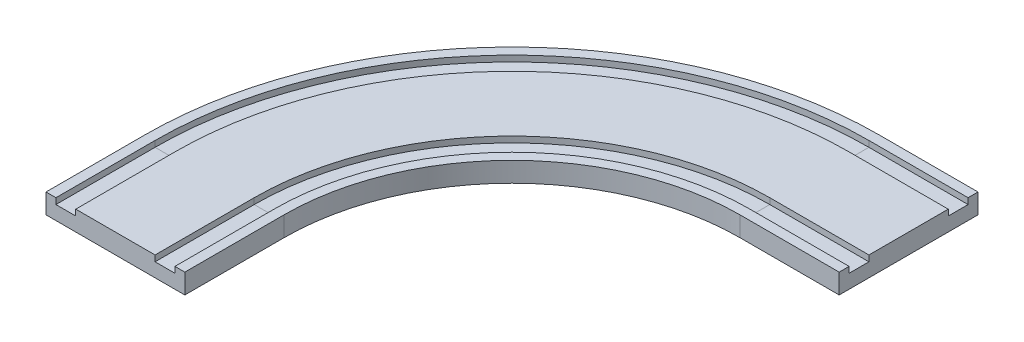
ISO-10303-21;
HEADER;
FILE_DESCRIPTION(('STEP AP214'),'2;1');
FILE_NAME('part.step','',(''),(''),'','','');
FILE_SCHEMA(('AUTOMOTIVE_DESIGN { 1 0 10303 214 1 1 1 1 }'));
ENDSEC;
DATA;
#1=APPLICATION_CONTEXT('core data for automotive mechanical design processes');
#2=APPLICATION_PROTOCOL_DEFINITION('international standard','automotive_design',2000,#1);
#3=PRODUCT_CONTEXT('',#1,'mechanical');
#4=PRODUCT('Part','Part','',(#3));
#5=PRODUCT_RELATED_PRODUCT_CATEGORY('part','',(#4));
#6=PRODUCT_DEFINITION_FORMATION('','',#4);
#7=PRODUCT_DEFINITION_CONTEXT('part definition',#1,'design');
#8=PRODUCT_DEFINITION('design','',#6,#7);
#9=PRODUCT_DEFINITION_SHAPE('','',#8);
#10=(LENGTH_UNIT() NAMED_UNIT(*) SI_UNIT(.MILLI.,.METRE.));
#11=(NAMED_UNIT(*) PLANE_ANGLE_UNIT() SI_UNIT($,.RADIAN.));
#12=(NAMED_UNIT(*) SI_UNIT($,.STERADIAN.) SOLID_ANGLE_UNIT());
#13=UNCERTAINTY_MEASURE_WITH_UNIT(LENGTH_MEASURE(1.E-05),#10,'distance_accuracy_value','');
#14=(GEOMETRIC_REPRESENTATION_CONTEXT(3) GLOBAL_UNCERTAINTY_ASSIGNED_CONTEXT((#13)) GLOBAL_UNIT_ASSIGNED_CONTEXT((#10,
#11,#12)) REPRESENTATION_CONTEXT('',''));
#15=CARTESIAN_POINT('',(0.,0.,0.));
#16=DIRECTION('',(0.,0.,1.));
#17=DIRECTION('',(1.,0.,0.));
#18=AXIS2_PLACEMENT_3D('',#15,#16,#17);
#19=CARTESIAN_POINT('',(200.,10.,-164.999999999996));
#20=DIRECTION('',(-1.,0.,0.));
#21=DIRECTION('',(0.,0.,1.));
#22=AXIS2_PLACEMENT_3D('',#19,#20,#21);
#23=PLANE('',#22);
#24=DIRECTION('',(0.,-1.,0.));
#25=VECTOR('',#24,1.);
#26=CARTESIAN_POINT('',(200.000000000001,10.,-179.999999999997));
#27=LINE('',#26,#25);
#28=CARTESIAN_POINT('',(200.000000000001,10.,-179.999999999997));
#29=VERTEX_POINT('',#28);
#30=CARTESIAN_POINT('',(200.000000000001,7.,-179.999999999998));
#31=VERTEX_POINT('',#30);
#32=EDGE_CURVE('E279',#29,#31,#27,.T.);
#33=ORIENTED_EDGE('',*,*,#32,.T.);
#34=DIRECTION('',(0.,0.,1.));
#35=VECTOR('',#34,1.);
#36=CARTESIAN_POINT('',(200.000000000001,7.,-169.999999999997));
#37=LINE('',#36,#35);
#38=CARTESIAN_POINT('',(200.000000000001,7.,-169.999999999997));
#39=VERTEX_POINT('',#38);
#40=EDGE_CURVE('E312',#31,#39,#37,.T.);
#41=ORIENTED_EDGE('',*,*,#40,.T.);
#42=DIRECTION('',(0.,1.,0.));
#43=VECTOR('',#42,1.);
#44=CARTESIAN_POINT('',(200.000000000001,10.,-169.999999999997));
#45=LINE('',#44,#43);
#46=CARTESIAN_POINT('',(200.000000000001,10.,-169.999999999997));
#47=VERTEX_POINT('',#46);
#48=EDGE_CURVE('E276',#39,#47,#45,.T.);
#49=ORIENTED_EDGE('',*,*,#48,.T.);
#50=DIRECTION('',(0.,0.,-1.));
#51=VECTOR('',#50,1.);
#52=CARTESIAN_POINT('',(200.,10.,-164.999999999996));
#53=LINE('',#52,#51);
#54=CARTESIAN_POINT('',(200.,10.,-164.999999999996));
#55=VERTEX_POINT('',#54);
#56=EDGE_CURVE('E357',#55,#47,#53,.T.);
#57=ORIENTED_EDGE('',*,*,#56,.F.);
#58=DIRECTION('',(0.,-1.,0.));
#59=VECTOR('',#58,1.);
#60=CARTESIAN_POINT('',(200.,10.,-164.999999999996));
#61=LINE('',#60,#59);
#62=CARTESIAN_POINT('',(200.,0.,-164.999999999996));
#63=VERTEX_POINT('',#62);
#64=EDGE_CURVE('E401',#55,#63,#61,.T.);
#65=ORIENTED_EDGE('',*,*,#64,.T.);
#66=DIRECTION('',(0.,0.,-1.));
#67=VECTOR('',#66,1.);
#68=CARTESIAN_POINT('',(200.,0.,-164.999999999996));
#69=LINE('',#68,#67);
#70=CARTESIAN_POINT('',(200.000000000001,0.,-234.999999999997));
#71=VERTEX_POINT('',#70);
#72=EDGE_CURVE('E378',#63,#71,#69,.T.);
#73=ORIENTED_EDGE('',*,*,#72,.T.);
#74=DIRECTION('',(0.,-1.,0.));
#75=VECTOR('',#74,1.);
#76=CARTESIAN_POINT('',(200.000000000001,10.,-234.999999999997));
#77=LINE('',#76,#75);
#78=CARTESIAN_POINT('',(200.000000000001,10.,-234.999999999997));
#79=VERTEX_POINT('',#78);
#80=EDGE_CURVE('E398',#79,#71,#77,.T.);
#81=ORIENTED_EDGE('',*,*,#80,.F.);
#82=CARTESIAN_POINT('',(200.000000000001,10.,-229.999999999997));
#83=VERTEX_POINT('',#82);
#84=EDGE_CURVE('E356',#83,#79,#53,.T.);
#85=ORIENTED_EDGE('',*,*,#84,.F.);
#86=DIRECTION('',(0.,-1.,0.));
#87=VECTOR('',#86,1.);
#88=CARTESIAN_POINT('',(200.000000000001,10.,-229.999999999997));
#89=LINE('',#88,#87);
#90=CARTESIAN_POINT('',(200.000000000001,7.,-229.999999999998));
#91=VERTEX_POINT('',#90);
#92=EDGE_CURVE('E288',#83,#91,#89,.T.);
#93=ORIENTED_EDGE('',*,*,#92,.T.);
#94=DIRECTION('',(0.,0.,1.));
#95=VECTOR('',#94,1.);
#96=CARTESIAN_POINT('',(200.000000000001,7.,-229.999999999997));
#97=LINE('',#96,#95);
#98=CARTESIAN_POINT('',(200.000000000001,7.,-219.999999999997));
#99=VERTEX_POINT('',#98);
#100=EDGE_CURVE('E285',#91,#99,#97,.T.);
#101=ORIENTED_EDGE('',*,*,#100,.T.);
#102=DIRECTION('',(0.,1.,0.));
#103=VECTOR('',#102,1.);
#104=CARTESIAN_POINT('',(200.000000000001,10.,-219.999999999997));
#105=LINE('',#104,#103);
#106=CARTESIAN_POINT('',(200.000000000001,10.,-219.999999999997));
#107=VERTEX_POINT('',#106);
#108=EDGE_CURVE('E281',#99,#107,#105,.T.);
#109=ORIENTED_EDGE('',*,*,#108,.T.);
#110=EDGE_CURVE('E360',#29,#107,#53,.T.);
#111=ORIENTED_EDGE('',*,*,#110,.F.);
#112=EDGE_LOOP('',(#33,#41,#49,#57,#65,#73,#81,#85,#93,#101,#109,#111));
#113=FACE_BOUND('',#112,.T.);
#114=ADVANCED_FACE('F54',(#113),#23,.F.);
#115=CARTESIAN_POINT('',(-35.,10.,0.));
#116=DIRECTION('',(0.,0.,-1.));
#117=DIRECTION('',(-1.,0.,0.));
#118=AXIS2_PLACEMENT_3D('',#115,#116,#117);
#119=PLANE('',#118);
#120=DIRECTION('',(0.,1.,0.));
#121=VECTOR('',#120,1.);
#122=CARTESIAN_POINT('',(20.,10.,0.));
#123=LINE('',#122,#121);
#124=CARTESIAN_POINT('',(20.,7.,0.));
#125=VERTEX_POINT('',#124);
#126=CARTESIAN_POINT('',(20.,10.,0.));
#127=VERTEX_POINT('',#126);
#128=EDGE_CURVE('E280',#125,#127,#123,.T.);
#129=ORIENTED_EDGE('',*,*,#128,.T.);
#130=DIRECTION('',(1.,0.,0.));
#131=VECTOR('',#130,1.);
#132=CARTESIAN_POINT('',(-35.,10.,0.));
#133=LINE('',#132,#131);
#134=CARTESIAN_POINT('',(-20.,10.,0.));
#135=VERTEX_POINT('',#134);
#136=EDGE_CURVE('E371',#135,#127,#133,.T.);
#137=ORIENTED_EDGE('',*,*,#136,.F.);
#138=DIRECTION('',(0.,-1.,0.));
#139=VECTOR('',#138,1.);
#140=CARTESIAN_POINT('',(-20.,10.,0.));
#141=LINE('',#140,#139);
#142=CARTESIAN_POINT('',(-20.,7.,0.));
#143=VERTEX_POINT('',#142);
#144=EDGE_CURVE('E292',#135,#143,#141,.T.);
#145=ORIENTED_EDGE('',*,*,#144,.T.);
#146=DIRECTION('',(-1.,0.,0.));
#147=VECTOR('',#146,1.);
#148=CARTESIAN_POINT('',(-30.,7.,0.));
#149=LINE('',#148,#147);
#150=CARTESIAN_POINT('',(-30.,7.,0.));
#151=VERTEX_POINT('',#150);
#152=EDGE_CURVE('E295',#143,#151,#149,.T.);
#153=ORIENTED_EDGE('',*,*,#152,.T.);
#154=DIRECTION('',(0.,1.,0.));
#155=VECTOR('',#154,1.);
#156=CARTESIAN_POINT('',(-30.,10.,0.));
#157=LINE('',#156,#155);
#158=CARTESIAN_POINT('',(-30.,10.,0.));
#159=VERTEX_POINT('',#158);
#160=EDGE_CURVE('E291',#151,#159,#157,.T.);
#161=ORIENTED_EDGE('',*,*,#160,.T.);
#162=CARTESIAN_POINT('',(-35.,10.,0.));
#163=VERTEX_POINT('',#162);
#164=EDGE_CURVE('E367',#163,#159,#133,.T.);
#165=ORIENTED_EDGE('',*,*,#164,.F.);
#166=DIRECTION('',(0.,-1.,0.));
#167=VECTOR('',#166,1.);
#168=CARTESIAN_POINT('',(-35.,10.,0.));
#169=LINE('',#168,#167);
#170=CARTESIAN_POINT('',(-35.,0.,0.));
#171=VERTEX_POINT('',#170);
#172=EDGE_CURVE('E389',#163,#171,#169,.T.);
#173=ORIENTED_EDGE('',*,*,#172,.T.);
#174=DIRECTION('',(1.,0.,0.));
#175=VECTOR('',#174,1.);
#176=CARTESIAN_POINT('',(-35.,0.,0.));
#177=LINE('',#176,#175);
#178=CARTESIAN_POINT('',(35.,0.,0.));
#179=VERTEX_POINT('',#178);
#180=EDGE_CURVE('E352',#171,#179,#177,.T.);
#181=ORIENTED_EDGE('',*,*,#180,.T.);
#182=DIRECTION('',(0.,-1.,0.));
#183=VECTOR('',#182,1.);
#184=CARTESIAN_POINT('',(35.,10.,0.));
#185=LINE('',#184,#183);
#186=CARTESIAN_POINT('',(35.,10.,0.));
#187=VERTEX_POINT('',#186);
#188=EDGE_CURVE('E370',#187,#179,#185,.T.);
#189=ORIENTED_EDGE('',*,*,#188,.F.);
#190=CARTESIAN_POINT('',(30.,10.,0.));
#191=VERTEX_POINT('',#190);
#192=EDGE_CURVE('E366',#191,#187,#133,.T.);
#193=ORIENTED_EDGE('',*,*,#192,.F.);
#194=DIRECTION('',(0.,-1.,0.));
#195=VECTOR('',#194,1.);
#196=CARTESIAN_POINT('',(30.,10.,0.));
#197=LINE('',#196,#195);
#198=CARTESIAN_POINT('',(30.,7.,0.));
#199=VERTEX_POINT('',#198);
#200=EDGE_CURVE('E224',#191,#199,#197,.T.);
#201=ORIENTED_EDGE('',*,*,#200,.T.);
#202=DIRECTION('',(-1.,0.,0.));
#203=VECTOR('',#202,1.);
#204=CARTESIAN_POINT('',(30.,7.,0.));
#205=LINE('',#204,#203);
#206=EDGE_CURVE('E275',#199,#125,#205,.T.);
#207=ORIENTED_EDGE('',*,*,#206,.T.);
#208=EDGE_LOOP('',(#129,#137,#145,#153,#161,#165,#173,#181,#189,#193,#201,#207));
#209=FACE_BOUND('',#208,.T.);
#210=ADVANCED_FACE('F453',(#209),#119,.F.);
#211=CARTESIAN_POINT('',(150.,10.,-50.));
#212=DIRECTION('',(0.,-1.,0.));
#213=DIRECTION('',(0.,0.,-1.));
#214=AXIS2_PLACEMENT_3D('',#211,#212,#213);
#215=PLANE('',#214);
#216=DIRECTION('',(0.,0.,-1.));
#217=VECTOR('',#216,1.);
#218=CARTESIAN_POINT('',(20.,10.,0.999999999999998));
#219=LINE('',#218,#217);
#220=CARTESIAN_POINT('',(20.,10.,-50.));
#221=VERTEX_POINT('',#220);
#222=EDGE_CURVE('E227',#127,#221,#219,.T.);
#223=ORIENTED_EDGE('',*,*,#222,.T.);
#224=CARTESIAN_POINT('',(150.,10.,-50.));
#225=DIRECTION('',(0.,-1.,0.));
#226=DIRECTION('',(-1.,0.,0.));
#227=AXIS2_PLACEMENT_3D('',#224,#225,#226);
#228=CIRCLE('',#227,129.999999999998);
#229=CARTESIAN_POINT('',(150.,10.,-179.999999999998));
#230=VERTEX_POINT('',#229);
#231=EDGE_CURVE('E239',#221,#230,#228,.T.);
#232=ORIENTED_EDGE('',*,*,#231,.T.);
#233=DIRECTION('',(1.,0.,0.));
#234=VECTOR('',#233,1.);
#235=CARTESIAN_POINT('',(150.,10.,-179.999999999997));
#236=LINE('',#235,#234);
#237=EDGE_CURVE('E245',#230,#29,#236,.T.);
#238=ORIENTED_EDGE('',*,*,#237,.T.);
#239=ORIENTED_EDGE('',*,*,#110,.T.);
#240=DIRECTION('',(1.,0.,0.));
#241=VECTOR('',#240,1.);
#242=CARTESIAN_POINT('',(150.,10.,-219.999999999997));
#243=LINE('',#242,#241);
#244=CARTESIAN_POINT('',(150.,10.,-219.999999999997));
#245=VERTEX_POINT('',#244);
#246=EDGE_CURVE('E296',#245,#107,#243,.T.);
#247=ORIENTED_EDGE('',*,*,#246,.F.);
#248=CARTESIAN_POINT('',(150.,10.,-50.));
#249=DIRECTION('',(0.,-1.,0.));
#250=DIRECTION('',(-1.,0.,0.));
#251=AXIS2_PLACEMENT_3D('',#248,#249,#250);
#252=CIRCLE('',#251,169.999999999998);
#253=CARTESIAN_POINT('',(-20.,10.,-50.));
#254=VERTEX_POINT('',#253);
#255=EDGE_CURVE('E331',#254,#245,#252,.T.);
#256=ORIENTED_EDGE('',*,*,#255,.F.);
#257=DIRECTION('',(0.,0.,-1.));
#258=VECTOR('',#257,1.);
#259=CARTESIAN_POINT('',(-20.,10.,0.999999999999998));
#260=LINE('',#259,#258);
#261=EDGE_CURVE('E305',#135,#254,#260,.T.);
#262=ORIENTED_EDGE('',*,*,#261,.F.);
#263=ORIENTED_EDGE('',*,*,#136,.T.);
#264=EDGE_LOOP('',(#223,#232,#238,#239,#247,#256,#262,#263));
#265=FACE_BOUND('',#264,.T.);
#266=ADVANCED_FACE('F434',(#265),#215,.F.);
#267=DIRECTION('',(0.,0.,-1.));
#268=VECTOR('',#267,1.);
#269=CARTESIAN_POINT('',(30.,10.,0.999999999999998));
#270=LINE('',#269,#268);
#271=CARTESIAN_POINT('',(30.,10.,-50.));
#272=VERTEX_POINT('',#271);
#273=EDGE_CURVE('E218',#191,#272,#270,.T.);
#274=ORIENTED_EDGE('',*,*,#273,.F.);
#275=ORIENTED_EDGE('',*,*,#192,.T.);
#276=DIRECTION('',(0.,0.,-1.));
#277=VECTOR('',#276,1.);
#278=CARTESIAN_POINT('',(35.,10.,0.));
#279=LINE('',#278,#277);
#280=CARTESIAN_POINT('',(35.0000000000018,10.,-50.));
#281=VERTEX_POINT('',#280);
#282=EDGE_CURVE('E348',#187,#281,#279,.T.);
#283=ORIENTED_EDGE('',*,*,#282,.T.);
#284=CARTESIAN_POINT('',(150.,10.,-50.));
#285=DIRECTION('',(0.,-1.,0.));
#286=DIRECTION('',(0.,0.,-1.));
#287=AXIS2_PLACEMENT_3D('',#284,#285,#286);
#288=CIRCLE('',#287,114.999999999998);
#289=CARTESIAN_POINT('',(150.,10.,-164.999999999996));
#290=VERTEX_POINT('',#289);
#291=EDGE_CURVE('E351',#281,#290,#288,.T.);
#292=ORIENTED_EDGE('',*,*,#291,.T.);
#293=DIRECTION('',(1.,0.,0.));
#294=VECTOR('',#293,1.);
#295=CARTESIAN_POINT('',(150.,10.,-164.999999999996));
#296=LINE('',#295,#294);
#297=EDGE_CURVE('E354',#290,#55,#296,.T.);
#298=ORIENTED_EDGE('',*,*,#297,.T.);
#299=ORIENTED_EDGE('',*,*,#56,.T.);
#300=DIRECTION('',(1.,0.,0.));
#301=VECTOR('',#300,1.);
#302=CARTESIAN_POINT('',(150.,10.,-169.999999999997));
#303=LINE('',#302,#301);
#304=CARTESIAN_POINT('',(150.,10.,-169.999999999997));
#305=VERTEX_POINT('',#304);
#306=EDGE_CURVE('E238',#305,#47,#303,.T.);
#307=ORIENTED_EDGE('',*,*,#306,.F.);
#308=CARTESIAN_POINT('',(150.,10.,-50.));
#309=DIRECTION('',(0.,-1.,0.));
#310=DIRECTION('',(-1.,0.,0.));
#311=AXIS2_PLACEMENT_3D('',#308,#309,#310);
#312=CIRCLE('',#311,119.999999999998);
#313=EDGE_CURVE('E69',#272,#305,#312,.T.);
#314=ORIENTED_EDGE('',*,*,#313,.F.);
#315=EDGE_LOOP('',(#274,#275,#283,#292,#298,#299,#307,#314));
#316=FACE_BOUND('',#315,.T.);
#317=ADVANCED_FACE('F236',(#316),#215,.F.);
#318=DIRECTION('',(0.,0.,-1.));
#319=VECTOR('',#318,1.);
#320=CARTESIAN_POINT('',(-30.,10.,0.999999999999998));
#321=LINE('',#320,#319);
#322=CARTESIAN_POINT('',(-30.,10.,-50.));
#323=VERTEX_POINT('',#322);
#324=EDGE_CURVE('E309',#159,#323,#321,.T.);
#325=ORIENTED_EDGE('',*,*,#324,.T.);
#326=CARTESIAN_POINT('',(150.,10.,-50.));
#327=DIRECTION('',(0.,-1.,0.));
#328=DIRECTION('',(-1.,0.,0.));
#329=AXIS2_PLACEMENT_3D('',#326,#327,#328);
#330=CIRCLE('',#329,179.999999999998);
#331=CARTESIAN_POINT('',(150.,10.,-229.999999999998));
#332=VERTEX_POINT('',#331);
#333=EDGE_CURVE('E317',#323,#332,#330,.T.);
#334=ORIENTED_EDGE('',*,*,#333,.T.);
#335=DIRECTION('',(1.,0.,0.));
#336=VECTOR('',#335,1.);
#337=CARTESIAN_POINT('',(150.,10.,-229.999999999997));
#338=LINE('',#337,#336);
#339=EDGE_CURVE('E328',#332,#83,#338,.T.);
#340=ORIENTED_EDGE('',*,*,#339,.T.);
#341=ORIENTED_EDGE('',*,*,#84,.T.);
#342=DIRECTION('',(-1.,0.,0.));
#343=VECTOR('',#342,1.);
#344=CARTESIAN_POINT('',(200.000000000001,10.,-234.999999999997));
#345=LINE('',#344,#343);
#346=CARTESIAN_POINT('',(150.000000000001,10.,-234.999999999999));
#347=VERTEX_POINT('',#346);
#348=EDGE_CURVE('E359',#79,#347,#345,.T.);
#349=ORIENTED_EDGE('',*,*,#348,.T.);
#350=CARTESIAN_POINT('',(150.,10.,-50.));
#351=DIRECTION('',(0.,1.,0.));
#352=DIRECTION('',(0.,0.,1.));
#353=AXIS2_PLACEMENT_3D('',#350,#351,#352);
#354=CIRCLE('',#353,184.999999999999);
#355=CARTESIAN_POINT('',(-35.,10.,-50.));
#356=VERTEX_POINT('',#355);
#357=EDGE_CURVE('E362',#347,#356,#354,.T.);
#358=ORIENTED_EDGE('',*,*,#357,.T.);
#359=DIRECTION('',(0.,0.,1.));
#360=VECTOR('',#359,1.);
#361=CARTESIAN_POINT('',(-35.,10.,-50.));
#362=LINE('',#361,#360);
#363=EDGE_CURVE('E364',#356,#163,#362,.T.);
#364=ORIENTED_EDGE('',*,*,#363,.T.);
#365=ORIENTED_EDGE('',*,*,#164,.T.);
#366=EDGE_LOOP('',(#325,#334,#340,#341,#349,#358,#364,#365));
#367=FACE_BOUND('',#366,.T.);
#368=ADVANCED_FACE('F428',(#367),#215,.F.);
#369=CARTESIAN_POINT('',(35.,10.,0.));
#370=DIRECTION('',(-1.,0.,0.));
#371=DIRECTION('',(0.,0.,1.));
#372=AXIS2_PLACEMENT_3D('',#369,#370,#371);
#373=PLANE('',#372);
#374=DIRECTION('',(0.,0.,-1.));
#375=VECTOR('',#374,1.);
#376=CARTESIAN_POINT('',(35.,0.,0.));
#377=LINE('',#376,#375);
#378=CARTESIAN_POINT('',(35.0000000000018,0.,-50.));
#379=VERTEX_POINT('',#378);
#380=EDGE_CURVE('E284',#179,#379,#377,.T.);
#381=ORIENTED_EDGE('',*,*,#380,.T.);
#382=DIRECTION('',(0.,-1.,0.));
#383=VECTOR('',#382,1.);
#384=CARTESIAN_POINT('',(35.0000000000018,10.,-50.));
#385=LINE('',#384,#383);
#386=EDGE_CURVE('E12',#281,#379,#385,.T.);
#387=ORIENTED_EDGE('',*,*,#386,.F.);
#388=ORIENTED_EDGE('',*,*,#282,.F.);
#389=ORIENTED_EDGE('',*,*,#188,.T.);
#390=EDGE_LOOP('',(#381,#387,#388,#389));
#391=FACE_BOUND('',#390,.T.);
#392=ADVANCED_FACE('F56',(#391),#373,.F.);
#393=CARTESIAN_POINT('',(150.,10.,-50.));
#394=DIRECTION('',(0.,-1.,0.));
#395=DIRECTION('',(0.,0.,-1.));
#396=AXIS2_PLACEMENT_3D('',#393,#394,#395);
#397=CYLINDRICAL_SURFACE('',#396,114.999999999998);
#398=CARTESIAN_POINT('',(150.,0.,-50.));
#399=DIRECTION('',(0.,-1.,0.));
#400=DIRECTION('',(0.,0.,-1.));
#401=AXIS2_PLACEMENT_3D('',#398,#399,#400);
#402=CIRCLE('',#401,114.999999999998);
#403=CARTESIAN_POINT('',(150.,0.,-164.999999999996));
#404=VERTEX_POINT('',#403);
#405=EDGE_CURVE('E374',#379,#404,#402,.T.);
#406=ORIENTED_EDGE('',*,*,#405,.T.);
#407=DIRECTION('',(0.,-1.,0.));
#408=VECTOR('',#407,1.);
#409=CARTESIAN_POINT('',(150.,10.,-164.999999999996));
#410=LINE('',#409,#408);
#411=EDGE_CURVE('E62',#290,#404,#410,.T.);
#412=ORIENTED_EDGE('',*,*,#411,.F.);
#413=ORIENTED_EDGE('',*,*,#291,.F.);
#414=ORIENTED_EDGE('',*,*,#386,.T.);
#415=EDGE_LOOP('',(#406,#412,#413,#414));
#416=FACE_BOUND('',#415,.T.);
#417=ADVANCED_FACE('F475',(#416),#397,.F.);
#418=CARTESIAN_POINT('',(150.,10.,-164.999999999996));
#419=DIRECTION('',(0.,0.,-1.));
#420=DIRECTION('',(-1.,0.,0.));
#421=AXIS2_PLACEMENT_3D('',#418,#419,#420);
#422=PLANE('',#421);
#423=DIRECTION('',(1.,0.,0.));
#424=VECTOR('',#423,1.);
#425=CARTESIAN_POINT('',(150.,0.,-164.999999999996));
#426=LINE('',#425,#424);
#427=EDGE_CURVE('E376',#404,#63,#426,.T.);
#428=ORIENTED_EDGE('',*,*,#427,.T.);
#429=ORIENTED_EDGE('',*,*,#64,.F.);
#430=ORIENTED_EDGE('',*,*,#297,.F.);
#431=ORIENTED_EDGE('',*,*,#411,.T.);
#432=EDGE_LOOP('',(#428,#429,#430,#431));
#433=FACE_BOUND('',#432,.T.);
#434=ADVANCED_FACE('F408',(#433),#422,.F.);
#435=CARTESIAN_POINT('',(200.000000000001,10.,-234.999999999997));
#436=DIRECTION('',(0.,0.,1.));
#437=DIRECTION('',(1.,0.,0.));
#438=AXIS2_PLACEMENT_3D('',#435,#436,#437);
#439=PLANE('',#438);
#440=DIRECTION('',(-1.,0.,0.));
#441=VECTOR('',#440,1.);
#442=CARTESIAN_POINT('',(200.000000000001,0.,-234.999999999997));
#443=LINE('',#442,#441);
#444=CARTESIAN_POINT('',(150.000000000001,0.,-234.999999999999));
#445=VERTEX_POINT('',#444);
#446=EDGE_CURVE('E380',#71,#445,#443,.T.);
#447=ORIENTED_EDGE('',*,*,#446,.T.);
#448=DIRECTION('',(0.,-1.,0.));
#449=VECTOR('',#448,1.);
#450=CARTESIAN_POINT('',(150.000000000001,10.,-234.999999999999));
#451=LINE('',#450,#449);
#452=EDGE_CURVE('E395',#347,#445,#451,.T.);
#453=ORIENTED_EDGE('',*,*,#452,.F.);
#454=ORIENTED_EDGE('',*,*,#348,.F.);
#455=ORIENTED_EDGE('',*,*,#80,.T.);
#456=EDGE_LOOP('',(#447,#453,#454,#455));
#457=FACE_BOUND('',#456,.T.);
#458=ADVANCED_FACE('F424',(#457),#439,.F.);
#459=CARTESIAN_POINT('',(150.,10.,-50.));
#460=DIRECTION('',(0.,-1.,0.));
#461=DIRECTION('',(0.,0.,-1.));
#462=AXIS2_PLACEMENT_3D('',#459,#460,#461);
#463=CYLINDRICAL_SURFACE('',#462,184.999999999999);
#464=CARTESIAN_POINT('',(150.,0.,-50.));
#465=DIRECTION('',(0.,1.,0.));
#466=DIRECTION('',(0.,0.,1.));
#467=AXIS2_PLACEMENT_3D('',#464,#465,#466);
#468=CIRCLE('',#467,184.999999999999);
#469=CARTESIAN_POINT('',(-35.,0.,-50.));
#470=VERTEX_POINT('',#469);
#471=EDGE_CURVE('E382',#445,#470,#468,.T.);
#472=ORIENTED_EDGE('',*,*,#471,.T.);
#473=DIRECTION('',(0.,-1.,0.));
#474=VECTOR('',#473,1.);
#475=CARTESIAN_POINT('',(-35.,10.,-50.));
#476=LINE('',#475,#474);
#477=EDGE_CURVE('E392',#356,#470,#476,.T.);
#478=ORIENTED_EDGE('',*,*,#477,.F.);
#479=ORIENTED_EDGE('',*,*,#357,.F.);
#480=ORIENTED_EDGE('',*,*,#452,.T.);
#481=EDGE_LOOP('',(#472,#478,#479,#480));
#482=FACE_BOUND('',#481,.T.);
#483=ADVANCED_FACE('F693',(#482),#463,.T.);
#484=CARTESIAN_POINT('',(-35.,10.,-50.));
#485=DIRECTION('',(1.,0.,0.));
#486=DIRECTION('',(0.,0.,-1.));
#487=AXIS2_PLACEMENT_3D('',#484,#485,#486);
#488=PLANE('',#487);
#489=DIRECTION('',(0.,0.,1.));
#490=VECTOR('',#489,1.);
#491=CARTESIAN_POINT('',(-35.,0.,-50.));
#492=LINE('',#491,#490);
#493=EDGE_CURVE('E384',#470,#171,#492,.T.);
#494=ORIENTED_EDGE('',*,*,#493,.T.);
#495=ORIENTED_EDGE('',*,*,#172,.F.);
#496=ORIENTED_EDGE('',*,*,#363,.F.);
#497=ORIENTED_EDGE('',*,*,#477,.T.);
#498=EDGE_LOOP('',(#494,#495,#496,#497));
#499=FACE_BOUND('',#498,.T.);
#500=ADVANCED_FACE('F689',(#499),#488,.F.);
#501=CARTESIAN_POINT('',(150.,0.,-50.));
#502=DIRECTION('',(0.,-1.,0.));
#503=DIRECTION('',(0.,0.,-1.));
#504=AXIS2_PLACEMENT_3D('',#501,#502,#503);
#505=PLANE('',#504);
#506=ORIENTED_EDGE('',*,*,#380,.F.);
#507=ORIENTED_EDGE('',*,*,#180,.F.);
#508=ORIENTED_EDGE('',*,*,#493,.F.);
#509=ORIENTED_EDGE('',*,*,#471,.F.);
#510=ORIENTED_EDGE('',*,*,#446,.F.);
#511=ORIENTED_EDGE('',*,*,#72,.F.);
#512=ORIENTED_EDGE('',*,*,#427,.F.);
#513=ORIENTED_EDGE('',*,*,#405,.F.);
#514=EDGE_LOOP('',(#506,#507,#508,#509,#510,#511,#512,#513));
#515=FACE_BOUND('',#514,.T.);
#516=ADVANCED_FACE('F414',(#515),#505,.T.);
#517=CARTESIAN_POINT('',(-30.,10.,0.999999999999998));
#518=DIRECTION('',(1.,0.,0.));
#519=DIRECTION('',(0.,0.,-1.));
#520=AXIS2_PLACEMENT_3D('',#517,#518,#519);
#521=PLANE('',#520);
#522=DIRECTION('',(0.,0.,-1.));
#523=VECTOR('',#522,1.);
#524=CARTESIAN_POINT('',(-30.,7.,0.999999999999998));
#525=LINE('',#524,#523);
#526=CARTESIAN_POINT('',(-30.,7.,-50.));
#527=VERTEX_POINT('',#526);
#528=EDGE_CURVE('E306',#151,#527,#525,.T.);
#529=ORIENTED_EDGE('',*,*,#528,.T.);
#530=DIRECTION('',(0.,-1.,0.));
#531=VECTOR('',#530,1.);
#532=CARTESIAN_POINT('',(-29.9999999999991,10.,-50.));
#533=LINE('',#532,#531);
#534=EDGE_CURVE('E301',#323,#527,#533,.T.);
#535=ORIENTED_EDGE('',*,*,#534,.F.);
#536=ORIENTED_EDGE('',*,*,#324,.F.);
#537=ORIENTED_EDGE('',*,*,#160,.F.);
#538=EDGE_LOOP('',(#529,#535,#536,#537));
#539=FACE_BOUND('',#538,.T.);
#540=ADVANCED_FACE('F449',(#539),#521,.T.);
#541=CARTESIAN_POINT('',(-30.,7.,0.999999999999998));
#542=DIRECTION('',(0.,1.,0.));
#543=DIRECTION('',(0.,0.,1.));
#544=AXIS2_PLACEMENT_3D('',#541,#542,#543);
#545=PLANE('',#544);
#546=DIRECTION('',(0.,0.,-1.));
#547=VECTOR('',#546,1.);
#548=CARTESIAN_POINT('',(-20.,7.,0.999999999999998));
#549=LINE('',#548,#547);
#550=CARTESIAN_POINT('',(-20.,7.,-50.));
#551=VERTEX_POINT('',#550);
#552=EDGE_CURVE('E308',#143,#551,#549,.T.);
#553=ORIENTED_EDGE('',*,*,#552,.T.);
#554=DIRECTION('',(1.,0.,0.));
#555=VECTOR('',#554,1.);
#556=CARTESIAN_POINT('',(-29.9999999999991,7.,-50.));
#557=LINE('',#556,#555);
#558=EDGE_CURVE('E304',#527,#551,#557,.T.);
#559=ORIENTED_EDGE('',*,*,#558,.F.);
#560=ORIENTED_EDGE('',*,*,#528,.F.);
#561=ORIENTED_EDGE('',*,*,#152,.F.);
#562=EDGE_LOOP('',(#553,#559,#560,#561));
#563=FACE_BOUND('',#562,.T.);
#564=ADVANCED_FACE('F457',(#563),#545,.T.);
#565=CARTESIAN_POINT('',(-20.,10.,0.999999999999998));
#566=DIRECTION('',(-1.,0.,0.));
#567=DIRECTION('',(0.,-1.,0.));
#568=AXIS2_PLACEMENT_3D('',#565,#566,#567);
#569=PLANE('',#568);
#570=ORIENTED_EDGE('',*,*,#261,.T.);
#571=DIRECTION('',(0.,1.,0.));
#572=VECTOR('',#571,1.);
#573=CARTESIAN_POINT('',(-19.9999999999991,10.,-50.));
#574=LINE('',#573,#572);
#575=EDGE_CURVE('E323',#551,#254,#574,.T.);
#576=ORIENTED_EDGE('',*,*,#575,.F.);
#577=ORIENTED_EDGE('',*,*,#552,.F.);
#578=ORIENTED_EDGE('',*,*,#144,.F.);
#579=EDGE_LOOP('',(#570,#576,#577,#578));
#580=FACE_BOUND('',#579,.T.);
#581=ADVANCED_FACE('F462',(#580),#569,.T.);
#582=CARTESIAN_POINT('',(150.,10.,-50.));
#583=DIRECTION('',(0.,-1.,0.));
#584=DIRECTION('',(0.,0.,-1.));
#585=AXIS2_PLACEMENT_3D('',#582,#583,#584);
#586=CYLINDRICAL_SURFACE('',#585,179.999999999998);
#587=CARTESIAN_POINT('',(150.,7.,-50.));
#588=DIRECTION('',(0.,-1.,0.));
#589=DIRECTION('',(-1.,0.,0.));
#590=AXIS2_PLACEMENT_3D('',#587,#588,#589);
#591=CIRCLE('',#590,179.999999999998);
#592=CARTESIAN_POINT('',(150.,7.,-229.999999999998));
#593=VERTEX_POINT('',#592);
#594=EDGE_CURVE('E316',#527,#593,#591,.T.);
#595=ORIENTED_EDGE('',*,*,#594,.T.);
#596=DIRECTION('',(0.,-1.,0.));
#597=VECTOR('',#596,1.);
#598=CARTESIAN_POINT('',(150.,10.,-229.999999999998));
#599=LINE('',#598,#597);
#600=EDGE_CURVE('E313',#332,#593,#599,.T.);
#601=ORIENTED_EDGE('',*,*,#600,.F.);
#602=ORIENTED_EDGE('',*,*,#333,.F.);
#603=ORIENTED_EDGE('',*,*,#534,.T.);
#604=EDGE_LOOP('',(#595,#601,#602,#603));
#605=FACE_BOUND('',#604,.T.);
#606=ADVANCED_FACE('F444',(#605),#586,.F.);
#607=CARTESIAN_POINT('',(-29.9999999999983,7.,-50.));
#608=DIRECTION('',(0.,1.,0.));
#609=DIRECTION('',(0.,0.,1.));
#610=AXIS2_PLACEMENT_3D('',#607,#608,#609);
#611=PLANE('',#610);
#612=CARTESIAN_POINT('',(150.,7.,-50.));
#613=DIRECTION('',(0.,-1.,0.));
#614=DIRECTION('',(-1.,0.,0.));
#615=AXIS2_PLACEMENT_3D('',#612,#613,#614);
#616=CIRCLE('',#615,169.999999999998);
#617=CARTESIAN_POINT('',(150.,7.,-219.999999999998));
#618=VERTEX_POINT('',#617);
#619=EDGE_CURVE('E337',#551,#618,#616,.T.);
#620=ORIENTED_EDGE('',*,*,#619,.T.);
#621=DIRECTION('',(0.,0.,1.));
#622=VECTOR('',#621,1.);
#623=CARTESIAN_POINT('',(150.,7.,-229.999999999998));
#624=LINE('',#623,#622);
#625=EDGE_CURVE('E320',#593,#618,#624,.T.);
#626=ORIENTED_EDGE('',*,*,#625,.F.);
#627=ORIENTED_EDGE('',*,*,#594,.F.);
#628=ORIENTED_EDGE('',*,*,#558,.T.);
#629=EDGE_LOOP('',(#620,#626,#627,#628));
#630=FACE_BOUND('',#629,.T.);
#631=ADVANCED_FACE('F466',(#630),#611,.T.);
#632=CARTESIAN_POINT('',(150.,10.,-50.));
#633=DIRECTION('',(0.,-1.,0.));
#634=DIRECTION('',(0.,0.,-1.));
#635=AXIS2_PLACEMENT_3D('',#632,#633,#634);
#636=CYLINDRICAL_SURFACE('',#635,169.999999999998);
#637=ORIENTED_EDGE('',*,*,#255,.T.);
#638=DIRECTION('',(0.,1.,0.));
#639=VECTOR('',#638,1.);
#640=CARTESIAN_POINT('',(150.,10.,-219.999999999998));
#641=LINE('',#640,#639);
#642=EDGE_CURVE('E77',#618,#245,#641,.T.);
#643=ORIENTED_EDGE('',*,*,#642,.F.);
#644=ORIENTED_EDGE('',*,*,#619,.F.);
#645=ORIENTED_EDGE('',*,*,#575,.T.);
#646=EDGE_LOOP('',(#637,#643,#644,#645));
#647=FACE_BOUND('',#646,.T.);
#648=ADVANCED_FACE('F467',(#647),#636,.T.);
#649=CARTESIAN_POINT('',(150.,10.,-229.999999999997));
#650=DIRECTION('',(0.,0.,1.));
#651=DIRECTION('',(1.,0.,0.));
#652=AXIS2_PLACEMENT_3D('',#649,#650,#651);
#653=PLANE('',#652);
#654=ORIENTED_EDGE('',*,*,#339,.F.);
#655=ORIENTED_EDGE('',*,*,#600,.T.);
#656=DIRECTION('',(1.,0.,0.));
#657=VECTOR('',#656,1.);
#658=CARTESIAN_POINT('',(150.,7.,-229.999999999997));
#659=LINE('',#658,#657);
#660=EDGE_CURVE('E324',#593,#91,#659,.T.);
#661=ORIENTED_EDGE('',*,*,#660,.T.);
#662=ORIENTED_EDGE('',*,*,#92,.F.);
#663=EDGE_LOOP('',(#654,#655,#661,#662));
#664=FACE_BOUND('',#663,.T.);
#665=ADVANCED_FACE('F441',(#664),#653,.T.);
#666=CARTESIAN_POINT('',(150.,7.,-229.999999999997));
#667=DIRECTION('',(0.,1.,0.));
#668=DIRECTION('',(0.,0.,1.));
#669=AXIS2_PLACEMENT_3D('',#666,#667,#668);
#670=PLANE('',#669);
#671=ORIENTED_EDGE('',*,*,#660,.F.);
#672=ORIENTED_EDGE('',*,*,#625,.T.);
#673=DIRECTION('',(1.,0.,0.));
#674=VECTOR('',#673,1.);
#675=CARTESIAN_POINT('',(150.,7.,-219.999999999997));
#676=LINE('',#675,#674);
#677=EDGE_CURVE('E327',#618,#99,#676,.T.);
#678=ORIENTED_EDGE('',*,*,#677,.T.);
#679=ORIENTED_EDGE('',*,*,#100,.F.);
#680=EDGE_LOOP('',(#671,#672,#678,#679));
#681=FACE_BOUND('',#680,.T.);
#682=ADVANCED_FACE('F438',(#681),#670,.T.);
#683=CARTESIAN_POINT('',(150.,10.,-219.999999999997));
#684=DIRECTION('',(0.,0.,-1.));
#685=DIRECTION('',(-1.,0.,0.));
#686=AXIS2_PLACEMENT_3D('',#683,#684,#685);
#687=PLANE('',#686);
#688=ORIENTED_EDGE('',*,*,#677,.F.);
#689=ORIENTED_EDGE('',*,*,#642,.T.);
#690=ORIENTED_EDGE('',*,*,#246,.T.);
#691=ORIENTED_EDGE('',*,*,#108,.F.);
#692=EDGE_LOOP('',(#688,#689,#690,#691));
#693=FACE_BOUND('',#692,.T.);
#694=ADVANCED_FACE('F436',(#693),#687,.T.);
#695=CARTESIAN_POINT('',(20.,10.,0.999999999999998));
#696=DIRECTION('',(1.,0.,0.));
#697=DIRECTION('',(0.,0.,-1.));
#698=AXIS2_PLACEMENT_3D('',#695,#696,#697);
#699=PLANE('',#698);
#700=DIRECTION('',(0.,0.,-1.));
#701=VECTOR('',#700,1.);
#702=CARTESIAN_POINT('',(20.,7.,0.999999999999998));
#703=LINE('',#702,#701);
#704=CARTESIAN_POINT('',(20.,7.,-50.));
#705=VERTEX_POINT('',#704);
#706=EDGE_CURVE('E255',#125,#705,#703,.T.);
#707=ORIENTED_EDGE('',*,*,#706,.T.);
#708=DIRECTION('',(0.,-1.,0.));
#709=VECTOR('',#708,1.);
#710=CARTESIAN_POINT('',(20.0000000000009,10.,-50.));
#711=LINE('',#710,#709);
#712=EDGE_CURVE('E251',#221,#705,#711,.T.);
#713=ORIENTED_EDGE('',*,*,#712,.F.);
#714=ORIENTED_EDGE('',*,*,#222,.F.);
#715=ORIENTED_EDGE('',*,*,#128,.F.);
#716=EDGE_LOOP('',(#707,#713,#714,#715));
#717=FACE_BOUND('',#716,.T.);
#718=ADVANCED_FACE('F498',(#717),#699,.T.);
#719=CARTESIAN_POINT('',(30.,7.,0.999999999999998));
#720=DIRECTION('',(0.,1.,0.));
#721=DIRECTION('',(0.,0.,1.));
#722=AXIS2_PLACEMENT_3D('',#719,#720,#721);
#723=PLANE('',#722);
#724=DIRECTION('',(0.,0.,-1.));
#725=VECTOR('',#724,1.);
#726=CARTESIAN_POINT('',(30.,7.,0.999999999999998));
#727=LINE('',#726,#725);
#728=CARTESIAN_POINT('',(30.,7.,-50.));
#729=VERTEX_POINT('',#728);
#730=EDGE_CURVE('E254',#199,#729,#727,.T.);
#731=ORIENTED_EDGE('',*,*,#730,.T.);
#732=DIRECTION('',(1.,0.,0.));
#733=VECTOR('',#732,1.);
#734=CARTESIAN_POINT('',(30.0000000000009,7.,-50.));
#735=LINE('',#734,#733);
#736=EDGE_CURVE('E233',#705,#729,#735,.T.);
#737=ORIENTED_EDGE('',*,*,#736,.F.);
#738=ORIENTED_EDGE('',*,*,#706,.F.);
#739=ORIENTED_EDGE('',*,*,#206,.F.);
#740=EDGE_LOOP('',(#731,#737,#738,#739));
#741=FACE_BOUND('',#740,.T.);
#742=ADVANCED_FACE('F501',(#741),#723,.T.);
#743=CARTESIAN_POINT('',(30.,10.,0.999999999999998));
#744=DIRECTION('',(-1.,0.,0.));
#745=DIRECTION('',(0.,0.,1.));
#746=AXIS2_PLACEMENT_3D('',#743,#744,#745);
#747=PLANE('',#746);
#748=ORIENTED_EDGE('',*,*,#273,.T.);
#749=DIRECTION('',(0.,1.,0.));
#750=VECTOR('',#749,1.);
#751=CARTESIAN_POINT('',(30.0000000000009,10.,-50.));
#752=LINE('',#751,#750);
#753=EDGE_CURVE('E221',#729,#272,#752,.T.);
#754=ORIENTED_EDGE('',*,*,#753,.F.);
#755=ORIENTED_EDGE('',*,*,#730,.F.);
#756=ORIENTED_EDGE('',*,*,#200,.F.);
#757=EDGE_LOOP('',(#748,#754,#755,#756));
#758=FACE_BOUND('',#757,.T.);
#759=ADVANCED_FACE('F219',(#758),#747,.T.);
#760=CARTESIAN_POINT('',(150.,10.,-50.));
#761=DIRECTION('',(0.,-1.,0.));
#762=DIRECTION('',(0.,0.,-1.));
#763=AXIS2_PLACEMENT_3D('',#760,#761,#762);
#764=CYLINDRICAL_SURFACE('',#763,129.999999999998);
#765=CARTESIAN_POINT('',(150.,7.,-50.));
#766=DIRECTION('',(0.,-1.,0.));
#767=DIRECTION('',(-1.,0.,0.));
#768=AXIS2_PLACEMENT_3D('',#765,#766,#767);
#769=CIRCLE('',#768,129.999999999998);
#770=CARTESIAN_POINT('',(150.,7.,-179.999999999998));
#771=VERTEX_POINT('',#770);
#772=EDGE_CURVE('E259',#705,#771,#769,.T.);
#773=ORIENTED_EDGE('',*,*,#772,.T.);
#774=DIRECTION('',(0.,-1.,0.));
#775=VECTOR('',#774,1.);
#776=CARTESIAN_POINT('',(150.,10.,-179.999999999998));
#777=LINE('',#776,#775);
#778=EDGE_CURVE('E242',#230,#771,#777,.T.);
#779=ORIENTED_EDGE('',*,*,#778,.F.);
#780=ORIENTED_EDGE('',*,*,#231,.F.);
#781=ORIENTED_EDGE('',*,*,#712,.T.);
#782=EDGE_LOOP('',(#773,#779,#780,#781));
#783=FACE_BOUND('',#782,.T.);
#784=ADVANCED_FACE('F488',(#783),#764,.F.);
#785=CARTESIAN_POINT('',(30.0000000000018,7.,-50.));
#786=DIRECTION('',(0.,1.,0.));
#787=DIRECTION('',(0.,0.,1.));
#788=AXIS2_PLACEMENT_3D('',#785,#786,#787);
#789=PLANE('',#788);
#790=CARTESIAN_POINT('',(150.,7.,-50.));
#791=DIRECTION('',(0.,-1.,0.));
#792=DIRECTION('',(-1.,0.,0.));
#793=AXIS2_PLACEMENT_3D('',#790,#791,#792);
#794=CIRCLE('',#793,119.999999999998);
#795=CARTESIAN_POINT('',(150.,7.,-169.999999999998));
#796=VERTEX_POINT('',#795);
#797=EDGE_CURVE('E232',#729,#796,#794,.T.);
#798=ORIENTED_EDGE('',*,*,#797,.T.);
#799=DIRECTION('',(0.,0.,1.));
#800=VECTOR('',#799,1.);
#801=CARTESIAN_POINT('',(150.,7.,-169.999999999998));
#802=LINE('',#801,#800);
#803=EDGE_CURVE('E262',#771,#796,#802,.T.);
#804=ORIENTED_EDGE('',*,*,#803,.F.);
#805=ORIENTED_EDGE('',*,*,#772,.F.);
#806=ORIENTED_EDGE('',*,*,#736,.T.);
#807=EDGE_LOOP('',(#798,#804,#805,#806));
#808=FACE_BOUND('',#807,.T.);
#809=ADVANCED_FACE('F484',(#808),#789,.T.);
#810=CARTESIAN_POINT('',(150.,10.,-50.));
#811=DIRECTION('',(0.,-1.,0.));
#812=DIRECTION('',(0.,0.,-1.));
#813=AXIS2_PLACEMENT_3D('',#810,#811,#812);
#814=CYLINDRICAL_SURFACE('',#813,119.999999999998);
#815=DIRECTION('',(0.,1.,0.));
#816=VECTOR('',#815,1.);
#817=CARTESIAN_POINT('',(150.,10.,-169.999999999998));
#818=LINE('',#817,#816);
#819=EDGE_CURVE('E250',#796,#305,#818,.T.);
#820=ORIENTED_EDGE('',*,*,#819,.F.);
#821=ORIENTED_EDGE('',*,*,#797,.F.);
#822=ORIENTED_EDGE('',*,*,#753,.T.);
#823=ORIENTED_EDGE('',*,*,#313,.T.);
#824=EDGE_LOOP('',(#820,#821,#822,#823));
#825=FACE_BOUND('',#824,.T.);
#826=ADVANCED_FACE('F230',(#825),#814,.T.);
#827=CARTESIAN_POINT('',(150.,10.,-179.999999999997));
#828=DIRECTION('',(0.,0.,1.));
#829=DIRECTION('',(1.,0.,0.));
#830=AXIS2_PLACEMENT_3D('',#827,#828,#829);
#831=PLANE('',#830);
#832=ORIENTED_EDGE('',*,*,#237,.F.);
#833=ORIENTED_EDGE('',*,*,#778,.T.);
#834=DIRECTION('',(1.,0.,0.));
#835=VECTOR('',#834,1.);
#836=CARTESIAN_POINT('',(150.,7.,-179.999999999997));
#837=LINE('',#836,#835);
#838=EDGE_CURVE('E248',#771,#31,#837,.T.);
#839=ORIENTED_EDGE('',*,*,#838,.T.);
#840=ORIENTED_EDGE('',*,*,#32,.F.);
#841=EDGE_LOOP('',(#832,#833,#839,#840));
#842=FACE_BOUND('',#841,.T.);
#843=ADVANCED_FACE('F491',(#842),#831,.T.);
#844=CARTESIAN_POINT('',(150.,7.,-169.999999999997));
#845=DIRECTION('',(0.,1.,0.));
#846=DIRECTION('',(0.,0.,1.));
#847=AXIS2_PLACEMENT_3D('',#844,#845,#846);
#848=PLANE('',#847);
#849=ORIENTED_EDGE('',*,*,#838,.F.);
#850=ORIENTED_EDGE('',*,*,#803,.T.);
#851=DIRECTION('',(1.,0.,0.));
#852=VECTOR('',#851,1.);
#853=CARTESIAN_POINT('',(150.,7.,-169.999999999997));
#854=LINE('',#853,#852);
#855=EDGE_CURVE('E265',#796,#39,#854,.T.);
#856=ORIENTED_EDGE('',*,*,#855,.T.);
#857=ORIENTED_EDGE('',*,*,#40,.F.);
#858=EDGE_LOOP('',(#849,#850,#856,#857));
#859=FACE_BOUND('',#858,.T.);
#860=ADVANCED_FACE('F480',(#859),#848,.T.);
#861=CARTESIAN_POINT('',(150.,10.,-169.999999999997));
#862=DIRECTION('',(0.,0.,-1.));
#863=DIRECTION('',(-1.,0.,0.));
#864=AXIS2_PLACEMENT_3D('',#861,#862,#863);
#865=PLANE('',#864);
#866=ORIENTED_EDGE('',*,*,#855,.F.);
#867=ORIENTED_EDGE('',*,*,#819,.T.);
#868=ORIENTED_EDGE('',*,*,#306,.T.);
#869=ORIENTED_EDGE('',*,*,#48,.F.);
#870=EDGE_LOOP('',(#866,#867,#868,#869));
#871=FACE_BOUND('',#870,.T.);
#872=ADVANCED_FACE('F478',(#871),#865,.T.);
#873=CLOSED_SHELL('',(#114,#210,#266,#317,#368,#392,#417,#434,#458,#483,#500,#516,#540,#564,
#581,#606,#631,#648,#665,#682,#694,#718,#742,#759,#784,#809,#826,#843,#860,#872));
#874=MANIFOLD_SOLID_BREP('B2',#873);
#875=ADVANCED_BREP_SHAPE_REPRESENTATION('',(#18,#874),#14);
#876=SHAPE_DEFINITION_REPRESENTATION(#9,#875);
ENDSEC;
END-ISO-10303-21;
